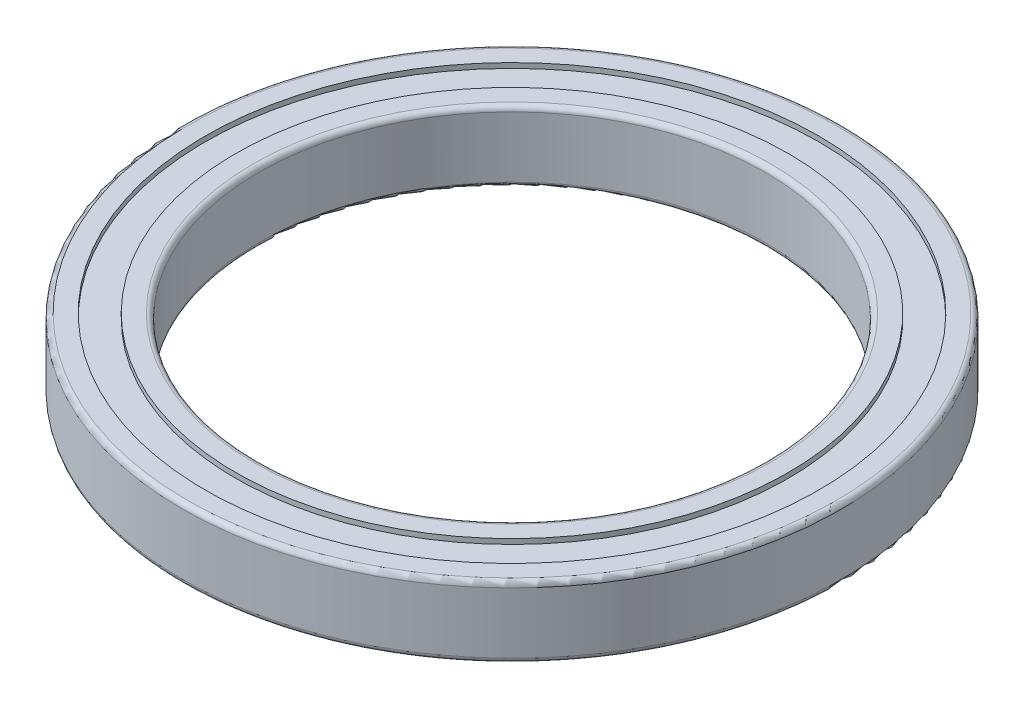
ISO-10303-21;
HEADER;
FILE_DESCRIPTION(('STEP AP214'),'2;1');
FILE_NAME('part.step','',(''),(''),'','','');
FILE_SCHEMA(('AUTOMOTIVE_DESIGN { 1 0 10303 214 1 1 1 1 }'));
ENDSEC;
DATA;
#1=APPLICATION_CONTEXT('core data for automotive mechanical design processes');
#2=APPLICATION_PROTOCOL_DEFINITION('international standard','automotive_design',2000,#1);
#3=PRODUCT_CONTEXT('',#1,'mechanical');
#4=PRODUCT('Part','Part','',(#3));
#5=PRODUCT_RELATED_PRODUCT_CATEGORY('part','',(#4));
#6=PRODUCT_DEFINITION_FORMATION('','',#4);
#7=PRODUCT_DEFINITION_CONTEXT('part definition',#1,'design');
#8=PRODUCT_DEFINITION('design','',#6,#7);
#9=PRODUCT_DEFINITION_SHAPE('','',#8);
#10=(LENGTH_UNIT() NAMED_UNIT(*) SI_UNIT(.MILLI.,.METRE.));
#11=(NAMED_UNIT(*) PLANE_ANGLE_UNIT() SI_UNIT($,.RADIAN.));
#12=(NAMED_UNIT(*) SI_UNIT($,.STERADIAN.) SOLID_ANGLE_UNIT());
#13=UNCERTAINTY_MEASURE_WITH_UNIT(LENGTH_MEASURE(1.E-05),#10,'distance_accuracy_value','');
#14=(GEOMETRIC_REPRESENTATION_CONTEXT(3) GLOBAL_UNCERTAINTY_ASSIGNED_CONTEXT((#13)) GLOBAL_UNIT_ASSIGNED_CONTEXT((#10,
#11,#12)) REPRESENTATION_CONTEXT('',''));
#15=CARTESIAN_POINT('',(0.,0.,0.));
#16=DIRECTION('',(0.,0.,1.));
#17=DIRECTION('',(1.,0.,0.));
#18=AXIS2_PLACEMENT_3D('',#15,#16,#17);
#19=CARTESIAN_POINT('',(0.,0.,0.));
#20=DIRECTION('',(0.,-1.,0.));
#21=DIRECTION('',(0.,0.,-1.));
#22=AXIS2_PLACEMENT_3D('',#19,#20,#21);
#23=CYLINDRICAL_SURFACE('',#22,25.);
#24=CARTESIAN_POINT('',(0.,0.5,0.));
#25=DIRECTION('',(0.,-1.,0.));
#26=DIRECTION('',(0.,0.,-1.));
#27=AXIS2_PLACEMENT_3D('',#24,#25,#26);
#28=CIRCLE('',#27,25.);
#29=CARTESIAN_POINT('',(0.,0.5,-25.));
#30=VERTEX_POINT('',#29);
#31=EDGE_CURVE('E49',#30,#30,#28,.T.);
#32=ORIENTED_EDGE('',*,*,#31,.T.);
#33=EDGE_LOOP('',(#32));
#34=FACE_BOUND('',#33,.T.);
#35=CARTESIAN_POINT('',(0.,6.5,0.));
#36=DIRECTION('',(0.,1.,0.));
#37=DIRECTION('',(0.,0.,1.));
#38=AXIS2_PLACEMENT_3D('',#35,#36,#37);
#39=CIRCLE('',#38,25.);
#40=CARTESIAN_POINT('',(0.,6.5,25.));
#41=VERTEX_POINT('',#40);
#42=EDGE_CURVE('E53',#41,#41,#39,.T.);
#43=ORIENTED_EDGE('',*,*,#42,.T.);
#44=EDGE_LOOP('',(#43));
#45=FACE_BOUND('',#44,.T.);
#46=ADVANCED_FACE('F39',(#34,#45),#23,.F.);
#47=CARTESIAN_POINT('',(25.,0.,0.));
#48=DIRECTION('',(0.,-1.,0.));
#49=DIRECTION('',(0.,0.,-1.));
#50=AXIS2_PLACEMENT_3D('',#47,#48,#49);
#51=PLANE('',#50);
#52=CARTESIAN_POINT('',(0.,0.,0.));
#53=DIRECTION('',(0.,-1.,0.));
#54=DIRECTION('',(0.,0.,-1.));
#55=AXIS2_PLACEMENT_3D('',#52,#53,#54);
#56=CIRCLE('',#55,25.5);
#57=CARTESIAN_POINT('',(0.,0.,-25.5));
#58=VERTEX_POINT('',#57);
#59=EDGE_CURVE('E46',#58,#58,#56,.F.);
#60=ORIENTED_EDGE('',*,*,#59,.T.);
#61=EDGE_LOOP('',(#60));
#62=FACE_BOUND('',#61,.T.);
#63=CARTESIAN_POINT('',(0.,0.,0.));
#64=DIRECTION('',(0.,-1.,0.));
#65=DIRECTION('',(0.,0.,-1.));
#66=AXIS2_PLACEMENT_3D('',#63,#64,#65);
#67=CIRCLE('',#66,27.25);
#68=CARTESIAN_POINT('',(0.,0.,-27.25));
#69=VERTEX_POINT('',#68);
#70=EDGE_CURVE('E72',#69,#69,#67,.T.);
#71=ORIENTED_EDGE('',*,*,#70,.T.);
#72=EDGE_LOOP('',(#71));
#73=FACE_BOUND('',#72,.T.);
#74=ADVANCED_FACE('F111',(#62,#73),#51,.T.);
#75=CARTESIAN_POINT('',(0.,0.,0.));
#76=DIRECTION('',(0.,-1.,0.));
#77=DIRECTION('',(0.,0.,-1.));
#78=AXIS2_PLACEMENT_3D('',#75,#76,#77);
#79=CYLINDRICAL_SURFACE('',#78,27.25);
#80=CARTESIAN_POINT('',(0.,0.5,0.));
#81=DIRECTION('',(0.,-1.,0.));
#82=DIRECTION('',(0.,0.,-1.));
#83=AXIS2_PLACEMENT_3D('',#80,#81,#82);
#84=CIRCLE('',#83,27.25);
#85=CARTESIAN_POINT('',(0.,0.5,-27.25));
#86=VERTEX_POINT('',#85);
#87=EDGE_CURVE('E74',#86,#86,#84,.T.);
#88=ORIENTED_EDGE('',*,*,#87,.T.);
#89=EDGE_LOOP('',(#88));
#90=FACE_BOUND('',#89,.T.);
#91=ORIENTED_EDGE('',*,*,#70,.F.);
#92=EDGE_LOOP('',(#91));
#93=FACE_BOUND('',#92,.T.);
#94=ADVANCED_FACE('F120',(#90,#93),#79,.T.);
#95=CARTESIAN_POINT('',(27.25,0.5,0.));
#96=DIRECTION('',(0.,-1.,0.));
#97=DIRECTION('',(0.,0.,-1.));
#98=AXIS2_PLACEMENT_3D('',#95,#96,#97);
#99=PLANE('',#98);
#100=CARTESIAN_POINT('',(0.,0.5,0.));
#101=DIRECTION('',(0.,-1.,0.));
#102=DIRECTION('',(0.,0.,-1.));
#103=AXIS2_PLACEMENT_3D('',#100,#101,#102);
#104=CIRCLE('',#103,30.25);
#105=CARTESIAN_POINT('',(0.,0.5,-30.25));
#106=VERTEX_POINT('',#105);
#107=EDGE_CURVE('E77',#106,#106,#104,.T.);
#108=ORIENTED_EDGE('',*,*,#107,.T.);
#109=EDGE_LOOP('',(#108));
#110=FACE_BOUND('',#109,.T.);
#111=ORIENTED_EDGE('',*,*,#87,.F.);
#112=EDGE_LOOP('',(#111));
#113=FACE_BOUND('',#112,.T.);
#114=ADVANCED_FACE('F223',(#110,#113),#99,.T.);
#115=CARTESIAN_POINT('',(0.,0.,0.));
#116=DIRECTION('',(0.,-1.,0.));
#117=DIRECTION('',(0.,0.,-1.));
#118=AXIS2_PLACEMENT_3D('',#115,#116,#117);
#119=CYLINDRICAL_SURFACE('',#118,30.25);
#120=CARTESIAN_POINT('',(0.,0.,0.));
#121=DIRECTION('',(0.,-1.,0.));
#122=DIRECTION('',(0.,0.,-1.));
#123=AXIS2_PLACEMENT_3D('',#120,#121,#122);
#124=CIRCLE('',#123,30.25);
#125=CARTESIAN_POINT('',(0.,0.,-30.25));
#126=VERTEX_POINT('',#125);
#127=EDGE_CURVE('E80',#126,#126,#124,.T.);
#128=ORIENTED_EDGE('',*,*,#127,.T.);
#129=EDGE_LOOP('',(#128));
#130=FACE_BOUND('',#129,.T.);
#131=ORIENTED_EDGE('',*,*,#107,.F.);
#132=EDGE_LOOP('',(#131));
#133=FACE_BOUND('',#132,.T.);
#134=ADVANCED_FACE('F216',(#130,#133),#119,.F.);
#135=CARTESIAN_POINT('',(30.25,0.,0.));
#136=DIRECTION('',(0.,-1.,0.));
#137=DIRECTION('',(0.,0.,-1.));
#138=AXIS2_PLACEMENT_3D('',#135,#136,#137);
#139=PLANE('',#138);
#140=CARTESIAN_POINT('',(0.,0.,0.));
#141=DIRECTION('',(0.,-1.,0.));
#142=DIRECTION('',(0.,0.,-1.));
#143=AXIS2_PLACEMENT_3D('',#140,#141,#142);
#144=CIRCLE('',#143,32.);
#145=CARTESIAN_POINT('',(0.,0.,-32.));
#146=VERTEX_POINT('',#145);
#147=EDGE_CURVE('E68',#146,#146,#144,.T.);
#148=ORIENTED_EDGE('',*,*,#147,.T.);
#149=EDGE_LOOP('',(#148));
#150=FACE_BOUND('',#149,.T.);
#151=ORIENTED_EDGE('',*,*,#127,.F.);
#152=EDGE_LOOP('',(#151));
#153=FACE_BOUND('',#152,.T.);
#154=ADVANCED_FACE('F206',(#150,#153),#139,.T.);
#155=CARTESIAN_POINT('',(0.,0.,0.));
#156=DIRECTION('',(0.,-1.,0.));
#157=DIRECTION('',(0.,0.,-1.));
#158=AXIS2_PLACEMENT_3D('',#155,#156,#157);
#159=CYLINDRICAL_SURFACE('',#158,32.5);
#160=CARTESIAN_POINT('',(0.,0.499999999999999,0.));
#161=DIRECTION('',(0.,-1.,0.));
#162=DIRECTION('',(0.,0.,-1.));
#163=AXIS2_PLACEMENT_3D('',#160,#161,#162);
#164=CIRCLE('',#163,32.5);
#165=CARTESIAN_POINT('',(0.,0.499999999999999,-32.5));
#166=VERTEX_POINT('',#165);
#167=EDGE_CURVE('E62',#166,#166,#164,.F.);
#168=ORIENTED_EDGE('',*,*,#167,.T.);
#169=EDGE_LOOP('',(#168));
#170=FACE_BOUND('',#169,.T.);
#171=CARTESIAN_POINT('',(0.,6.5,0.));
#172=DIRECTION('',(0.,1.,0.));
#173=DIRECTION('',(0.,0.,1.));
#174=AXIS2_PLACEMENT_3D('',#171,#172,#173);
#175=CIRCLE('',#174,32.5);
#176=CARTESIAN_POINT('',(0.,6.5,32.5));
#177=VERTEX_POINT('',#176);
#178=EDGE_CURVE('E65',#177,#177,#175,.F.);
#179=ORIENTED_EDGE('',*,*,#178,.T.);
#180=EDGE_LOOP('',(#179));
#181=FACE_BOUND('',#180,.T.);
#182=ADVANCED_FACE('F198',(#170,#181),#159,.T.);
#183=CARTESIAN_POINT('',(32.5,7.,0.));
#184=DIRECTION('',(0.,1.,0.));
#185=DIRECTION('',(0.,0.,1.));
#186=AXIS2_PLACEMENT_3D('',#183,#184,#185);
#187=PLANE('',#186);
#188=CARTESIAN_POINT('',(0.,7.,0.));
#189=DIRECTION('',(0.,1.,0.));
#190=DIRECTION('',(0.,0.,1.));
#191=AXIS2_PLACEMENT_3D('',#188,#189,#190);
#192=CIRCLE('',#191,32.);
#193=CARTESIAN_POINT('',(0.,7.,32.));
#194=VERTEX_POINT('',#193);
#195=EDGE_CURVE('E56',#194,#194,#192,.T.);
#196=ORIENTED_EDGE('',*,*,#195,.T.);
#197=EDGE_LOOP('',(#196));
#198=FACE_BOUND('',#197,.T.);
#199=CARTESIAN_POINT('',(0.,7.,0.));
#200=DIRECTION('',(0.,-1.,0.));
#201=DIRECTION('',(0.,0.,-1.));
#202=AXIS2_PLACEMENT_3D('',#199,#200,#201);
#203=CIRCLE('',#202,30.25);
#204=CARTESIAN_POINT('',(0.,7.,-30.25));
#205=VERTEX_POINT('',#204);
#206=EDGE_CURVE('E83',#205,#205,#203,.T.);
#207=ORIENTED_EDGE('',*,*,#206,.T.);
#208=EDGE_LOOP('',(#207));
#209=FACE_BOUND('',#208,.T.);
#210=ADVANCED_FACE('F186',(#198,#209),#187,.T.);
#211=CARTESIAN_POINT('',(0.,0.,0.));
#212=DIRECTION('',(0.,-1.,0.));
#213=DIRECTION('',(0.,0.,-1.));
#214=AXIS2_PLACEMENT_3D('',#211,#212,#213);
#215=CYLINDRICAL_SURFACE('',#214,30.25);
#216=CARTESIAN_POINT('',(0.,6.5,0.));
#217=DIRECTION('',(0.,-1.,0.));
#218=DIRECTION('',(0.,0.,-1.));
#219=AXIS2_PLACEMENT_3D('',#216,#217,#218);
#220=CIRCLE('',#219,30.25);
#221=CARTESIAN_POINT('',(0.,6.5,-30.25));
#222=VERTEX_POINT('',#221);
#223=EDGE_CURVE('E88',#222,#222,#220,.T.);
#224=ORIENTED_EDGE('',*,*,#223,.T.);
#225=EDGE_LOOP('',(#224));
#226=FACE_BOUND('',#225,.T.);
#227=ORIENTED_EDGE('',*,*,#206,.F.);
#228=EDGE_LOOP('',(#227));
#229=FACE_BOUND('',#228,.T.);
#230=ADVANCED_FACE('F177',(#226,#229),#215,.F.);
#231=CARTESIAN_POINT('',(30.25,6.5,0.));
#232=DIRECTION('',(0.,1.,0.));
#233=DIRECTION('',(0.,0.,1.));
#234=AXIS2_PLACEMENT_3D('',#231,#232,#233);
#235=PLANE('',#234);
#236=CARTESIAN_POINT('',(0.,6.5,0.));
#237=DIRECTION('',(0.,-1.,0.));
#238=DIRECTION('',(0.,0.,-1.));
#239=AXIS2_PLACEMENT_3D('',#236,#237,#238);
#240=CIRCLE('',#239,27.25);
#241=CARTESIAN_POINT('',(0.,6.5,-27.25));
#242=VERTEX_POINT('',#241);
#243=EDGE_CURVE('E90',#242,#242,#240,.T.);
#244=ORIENTED_EDGE('',*,*,#243,.T.);
#245=EDGE_LOOP('',(#244));
#246=FACE_BOUND('',#245,.T.);
#247=ORIENTED_EDGE('',*,*,#223,.F.);
#248=EDGE_LOOP('',(#247));
#249=FACE_BOUND('',#248,.T.);
#250=ADVANCED_FACE('F112',(#246,#249),#235,.T.);
#251=CARTESIAN_POINT('',(0.,0.,0.));
#252=DIRECTION('',(0.,-1.,0.));
#253=DIRECTION('',(0.,0.,-1.));
#254=AXIS2_PLACEMENT_3D('',#251,#252,#253);
#255=CYLINDRICAL_SURFACE('',#254,27.25);
#256=CARTESIAN_POINT('',(0.,7.,0.));
#257=DIRECTION('',(0.,-1.,0.));
#258=DIRECTION('',(0.,0.,-1.));
#259=AXIS2_PLACEMENT_3D('',#256,#257,#258);
#260=CIRCLE('',#259,27.25);
#261=CARTESIAN_POINT('',(0.,7.,-27.25));
#262=VERTEX_POINT('',#261);
#263=EDGE_CURVE('E95',#262,#262,#260,.T.);
#264=ORIENTED_EDGE('',*,*,#263,.T.);
#265=EDGE_LOOP('',(#264));
#266=FACE_BOUND('',#265,.T.);
#267=ORIENTED_EDGE('',*,*,#243,.F.);
#268=EDGE_LOOP('',(#267));
#269=FACE_BOUND('',#268,.T.);
#270=ADVANCED_FACE('F96',(#266,#269),#255,.T.);
#271=CARTESIAN_POINT('',(27.25,7.,0.));
#272=DIRECTION('',(0.,1.,0.));
#273=DIRECTION('',(0.,0.,1.));
#274=AXIS2_PLACEMENT_3D('',#271,#272,#273);
#275=PLANE('',#274);
#276=CARTESIAN_POINT('',(0.,7.,0.));
#277=DIRECTION('',(0.,1.,0.));
#278=DIRECTION('',(0.,0.,1.));
#279=AXIS2_PLACEMENT_3D('',#276,#277,#278);
#280=CIRCLE('',#279,25.5);
#281=CARTESIAN_POINT('',(0.,7.,25.5));
#282=VERTEX_POINT('',#281);
#283=EDGE_CURVE('E10',#282,#282,#280,.F.);
#284=ORIENTED_EDGE('',*,*,#283,.T.);
#285=EDGE_LOOP('',(#284));
#286=FACE_BOUND('',#285,.T.);
#287=ORIENTED_EDGE('',*,*,#263,.F.);
#288=EDGE_LOOP('',(#287));
#289=FACE_BOUND('',#288,.T.);
#290=ADVANCED_FACE('F97',(#286,#289),#275,.T.);
#291=CARTESIAN_POINT('',(0.,0.499999999999999,0.));
#292=DIRECTION('',(0.,-1.,0.));
#293=DIRECTION('',(0.,0.,-1.));
#294=AXIS2_PLACEMENT_3D('',#291,#292,#293);
#295=TOROIDAL_SURFACE('',#294,32.,0.5);
#296=ORIENTED_EDGE('',*,*,#167,.F.);
#297=EDGE_LOOP('',(#296));
#298=FACE_BOUND('',#297,.T.);
#299=ORIENTED_EDGE('',*,*,#147,.F.);
#300=EDGE_LOOP('',(#299));
#301=FACE_BOUND('',#300,.T.);
#302=ADVANCED_FACE('F101',(#298,#301),#295,.T.);
#303=CARTESIAN_POINT('',(0.,6.5,0.));
#304=DIRECTION('',(0.,1.,0.));
#305=DIRECTION('',(0.,0.,1.));
#306=AXIS2_PLACEMENT_3D('',#303,#304,#305);
#307=TOROIDAL_SURFACE('',#306,32.,0.5);
#308=ORIENTED_EDGE('',*,*,#195,.F.);
#309=EDGE_LOOP('',(#308));
#310=FACE_BOUND('',#309,.T.);
#311=ORIENTED_EDGE('',*,*,#178,.F.);
#312=EDGE_LOOP('',(#311));
#313=FACE_BOUND('',#312,.T.);
#314=ADVANCED_FACE('F110',(#310,#313),#307,.T.);
#315=CARTESIAN_POINT('',(0.,0.5,0.));
#316=DIRECTION('',(0.,-1.,0.));
#317=DIRECTION('',(0.,0.,-1.));
#318=AXIS2_PLACEMENT_3D('',#315,#316,#317);
#319=TOROIDAL_SURFACE('',#318,25.5,0.5);
#320=ORIENTED_EDGE('',*,*,#59,.F.);
#321=EDGE_LOOP('',(#320));
#322=FACE_BOUND('',#321,.T.);
#323=ORIENTED_EDGE('',*,*,#31,.F.);
#324=EDGE_LOOP('',(#323));
#325=FACE_BOUND('',#324,.T.);
#326=ADVANCED_FACE('F127',(#322,#325),#319,.T.);
#327=CARTESIAN_POINT('',(0.,6.5,0.));
#328=DIRECTION('',(0.,1.,0.));
#329=DIRECTION('',(0.,0.,1.));
#330=AXIS2_PLACEMENT_3D('',#327,#328,#329);
#331=TOROIDAL_SURFACE('',#330,25.5,0.5);
#332=ORIENTED_EDGE('',*,*,#42,.F.);
#333=EDGE_LOOP('',(#332));
#334=FACE_BOUND('',#333,.T.);
#335=ORIENTED_EDGE('',*,*,#283,.F.);
#336=EDGE_LOOP('',(#335));
#337=FACE_BOUND('',#336,.T.);
#338=ADVANCED_FACE('F41',(#334,#337),#331,.T.);
#339=CLOSED_SHELL('',(#46,#74,#94,#114,#134,#154,#182,#210,#230,#250,#270,#290,#302,#314,#326,#338));
#340=MANIFOLD_SOLID_BREP('B2',#339);
#341=ADVANCED_BREP_SHAPE_REPRESENTATION('',(#18,#340),#14);
#342=SHAPE_DEFINITION_REPRESENTATION(#9,#341);
ENDSEC;
END-ISO-10303-21;
